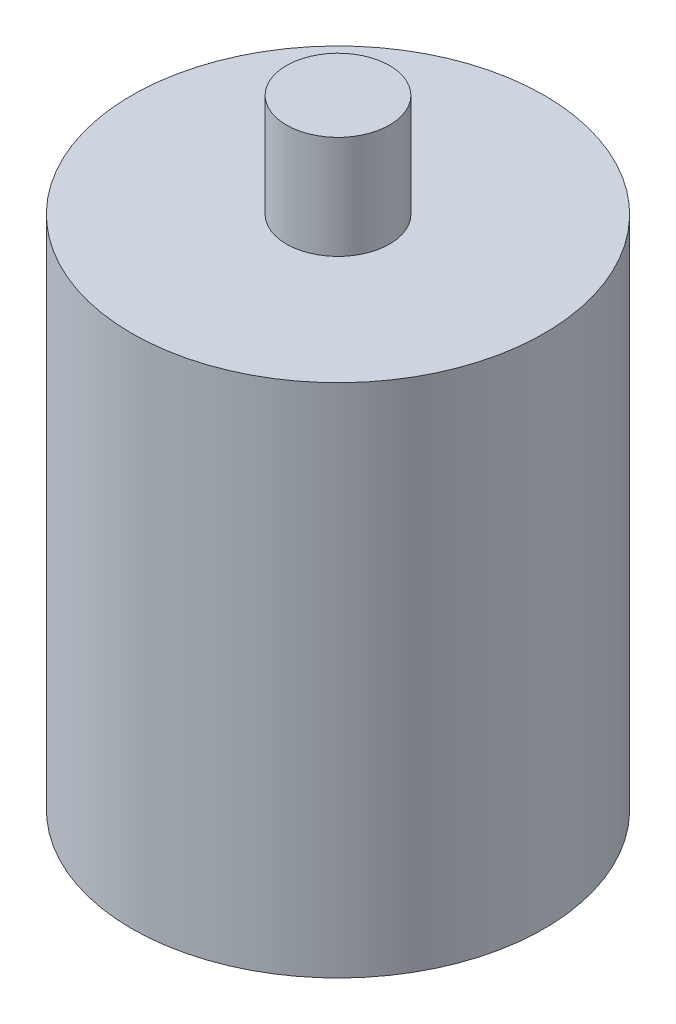
ISO-10303-21;
HEADER;
FILE_DESCRIPTION(('STEP AP214'),'2;1');
FILE_NAME('part.step','',(''),(''),'','','');
FILE_SCHEMA(('AUTOMOTIVE_DESIGN { 1 0 10303 214 1 1 1 1 }'));
ENDSEC;
DATA;
#1=APPLICATION_CONTEXT('core data for automotive mechanical design processes');
#2=APPLICATION_PROTOCOL_DEFINITION('international standard','automotive_design',2000,#1);
#3=PRODUCT_CONTEXT('',#1,'mechanical');
#4=PRODUCT('Part','Part','',(#3));
#5=PRODUCT_RELATED_PRODUCT_CATEGORY('part','',(#4));
#6=PRODUCT_DEFINITION_FORMATION('','',#4);
#7=PRODUCT_DEFINITION_CONTEXT('part definition',#1,'design');
#8=PRODUCT_DEFINITION('design','',#6,#7);
#9=PRODUCT_DEFINITION_SHAPE('','',#8);
#10=(LENGTH_UNIT() NAMED_UNIT(*) SI_UNIT(.MILLI.,.METRE.));
#11=(NAMED_UNIT(*) PLANE_ANGLE_UNIT() SI_UNIT($,.RADIAN.));
#12=(NAMED_UNIT(*) SI_UNIT($,.STERADIAN.) SOLID_ANGLE_UNIT());
#13=UNCERTAINTY_MEASURE_WITH_UNIT(LENGTH_MEASURE(1.E-05),#10,'distance_accuracy_value','');
#14=(GEOMETRIC_REPRESENTATION_CONTEXT(3) GLOBAL_UNCERTAINTY_ASSIGNED_CONTEXT((#13)) GLOBAL_UNIT_ASSIGNED_CONTEXT((#10,
#11,#12)) REPRESENTATION_CONTEXT('',''));
#15=CARTESIAN_POINT('',(0.,0.,0.));
#16=DIRECTION('',(0.,0.,1.));
#17=DIRECTION('',(1.,0.,0.));
#18=AXIS2_PLACEMENT_3D('',#15,#16,#17);
#19=CARTESIAN_POINT('',(0.,50.,0.));
#20=DIRECTION('',(0.,-1.,0.));
#21=DIRECTION('',(0.,0.,-1.));
#22=AXIS2_PLACEMENT_3D('',#19,#20,#21);
#23=CYLINDRICAL_SURFACE('',#22,20.);
#24=CARTESIAN_POINT('',(0.,50.,0.));
#25=DIRECTION('',(0.,1.,0.));
#26=DIRECTION('',(0.,0.,1.));
#27=AXIS2_PLACEMENT_3D('',#24,#25,#26);
#28=CIRCLE('',#27,20.);
#29=CARTESIAN_POINT('',(0.,50.,20.));
#30=VERTEX_POINT('',#29);
#31=EDGE_CURVE('E50',#30,#30,#28,.T.);
#32=ORIENTED_EDGE('',*,*,#31,.F.);
#33=EDGE_LOOP('',(#32));
#34=FACE_BOUND('',#33,.T.);
#35=CARTESIAN_POINT('',(0.,0.,0.));
#36=DIRECTION('',(0.,1.,0.));
#37=DIRECTION('',(0.,0.,1.));
#38=AXIS2_PLACEMENT_3D('',#35,#36,#37);
#39=CIRCLE('',#38,20.);
#40=CARTESIAN_POINT('',(0.,0.,20.));
#41=VERTEX_POINT('',#40);
#42=EDGE_CURVE('E56',#41,#41,#39,.T.);
#43=ORIENTED_EDGE('',*,*,#42,.T.);
#44=EDGE_LOOP('',(#43));
#45=FACE_BOUND('',#44,.T.);
#46=ADVANCED_FACE('F37',(#34,#45),#23,.T.);
#47=CARTESIAN_POINT('',(0.,50.,0.));
#48=DIRECTION('',(0.,1.,0.));
#49=DIRECTION('',(0.,0.,1.));
#50=AXIS2_PLACEMENT_3D('',#47,#48,#49);
#51=PLANE('',#50);
#52=CARTESIAN_POINT('',(0.,50.,0.));
#53=DIRECTION('',(0.,1.,0.));
#54=DIRECTION('',(0.,0.,1.));
#55=AXIS2_PLACEMENT_3D('',#52,#53,#54);
#56=CIRCLE('',#55,5.);
#57=CARTESIAN_POINT('',(0.,50.,5.));
#58=VERTEX_POINT('',#57);
#59=EDGE_CURVE('E10',#58,#58,#56,.T.);
#60=ORIENTED_EDGE('',*,*,#59,.F.);
#61=EDGE_LOOP('',(#60));
#62=FACE_BOUND('',#61,.T.);
#63=ORIENTED_EDGE('',*,*,#31,.T.);
#64=EDGE_LOOP('',(#63));
#65=FACE_BOUND('',#64,.T.);
#66=ADVANCED_FACE('F89',(#62,#65),#51,.T.);
#67=CARTESIAN_POINT('',(0.,0.,0.));
#68=DIRECTION('',(0.,1.,0.));
#69=DIRECTION('',(0.,0.,1.));
#70=AXIS2_PLACEMENT_3D('',#67,#68,#69);
#71=PLANE('',#70);
#72=ORIENTED_EDGE('',*,*,#42,.F.);
#73=EDGE_LOOP('',(#72));
#74=FACE_BOUND('',#73,.T.);
#75=ADVANCED_FACE('F94',(#74),#71,.F.);
#76=CARTESIAN_POINT('',(0.,60.,0.));
#77=DIRECTION('',(0.,-1.,0.));
#78=DIRECTION('',(0.,0.,-1.));
#79=AXIS2_PLACEMENT_3D('',#76,#77,#78);
#80=CYLINDRICAL_SURFACE('',#79,5.);
#81=CARTESIAN_POINT('',(0.,57.3364901443991,-5.));
#82=CARTESIAN_POINT('',(-0.0822886127533002,57.3364891469142,-4.9999992925055));
#83=CARTESIAN_POINT('',(-0.16458731835153,57.3296962807751,-4.99794915693954));
#84=CARTESIAN_POINT('',(-0.326788125304881,57.302768790177,-4.98997105593691));
#85=CARTESIAN_POINT('',(-0.40668950441142,57.2826301863757,-4.98404193389692));
#86=CARTESIAN_POINT('',(-0.561732707754528,57.2297441274888,-4.96895552501836));
#87=CARTESIAN_POINT('',(-0.636881364395375,57.1970152747801,-4.95980300250425));
#88=CARTESIAN_POINT('',(-0.780624181053133,57.1199540513432,-4.93922109237645));
#89=CARTESIAN_POINT('',(-0.84921746746967,57.0756201370037,-4.92779140192067));
#90=CARTESIAN_POINT('',(-0.979871797183745,56.9752661369264,-4.90350737192774));
#91=CARTESIAN_POINT('',(-1.04171807124434,56.9189735185132,-4.89062383657036));
#92=CARTESIAN_POINT('',(-1.15524920923324,56.7968809144889,-4.86505834210442));
#93=CARTESIAN_POINT('',(-1.20693236327441,56.7310793322741,-4.85237641724501));
#94=CARTESIAN_POINT('',(-1.29980037723708,56.5900193913615,-4.82834113993772));
#95=CARTESIAN_POINT('',(-1.34072309022214,56.5145816834083,-4.81702406663875));
#96=CARTESIAN_POINT('',(-1.4092139477476,56.3575008901688,-4.79743620394031));
#97=CARTESIAN_POINT('',(-1.43678529919973,56.2758593004711,-4.78916468313311));
#98=CARTESIAN_POINT('',(-1.47701633682652,56.1110998782686,-4.77690870838434));
#99=CARTESIAN_POINT('',(-1.49007196234677,56.0280874005351,-4.77281069324533));
#100=CARTESIAN_POINT('',(-1.50213730614672,55.8609569881823,-4.76902789749767));
#101=CARTESIAN_POINT('',(-1.50115042761078,55.77683932634,-4.76934204760571));
#102=CARTESIAN_POINT('',(-1.48546977199812,55.6131062357906,-4.77424744067778));
#103=CARTESIAN_POINT('',(-1.47127205262685,55.5334378940368,-4.7786838859914));
#104=CARTESIAN_POINT('',(-1.43037420427056,55.3776703581256,-4.79108356228624));
#105=CARTESIAN_POINT('',(-1.40367284141641,55.3015715170247,-4.79904714132351));
#106=CARTESIAN_POINT('',(-1.33816026653681,55.1538897947383,-4.81772733074973));
#107=CARTESIAN_POINT('',(-1.29918816934642,55.0823830604438,-4.82848016115952));
#108=CARTESIAN_POINT('',(-1.21035222588683,54.9467581223889,-4.85150987000065));
#109=CARTESIAN_POINT('',(-1.16048574002588,54.8826417149853,-4.86378711746991));
#110=CARTESIAN_POINT('',(-1.04881290765546,54.760803953637,-4.88911011297937));
#111=CARTESIAN_POINT('',(-0.986594907466972,54.7034614803694,-4.90216654310498));
#112=CARTESIAN_POINT('',(-0.853263259313966,54.5999361603348,-4.92712244063259));
#113=CARTESIAN_POINT('',(-0.782149051860887,54.5537540159846,-4.9390218351841));
#114=CARTESIAN_POINT('',(-0.632355038342803,54.4736302219343,-4.9604316006947));
#115=CARTESIAN_POINT('',(-0.55362774974795,54.4397726281492,-4.96992543668314));
#116=CARTESIAN_POINT('',(-0.391245415603519,54.3858905542994,-4.98533521832222));
#117=CARTESIAN_POINT('',(-0.307591751589581,54.3658622158666,-4.99125216186999));
#118=CARTESIAN_POINT('',(-0.140952242668331,54.3408379664997,-4.99868364643538));
#119=CARTESIAN_POINT('',(-0.0580500976011858,54.3353285585975,-5.0003485041779));
#120=CARTESIAN_POINT('',(0.107499605823385,54.3380593001111,-4.9995292324176));
#121=CARTESIAN_POINT('',(0.190147196690783,54.3462976140505,-4.99704565677756));
#122=CARTESIAN_POINT('',(0.350903605309699,54.3758747555106,-4.98830696987163));
#123=CARTESIAN_POINT('',(0.42907277261417,54.3969135319799,-4.98213829799417));
#124=CARTESIAN_POINT('',(0.580754638954522,54.4511333771773,-4.96674347841533));
#125=CARTESIAN_POINT('',(0.654266777025585,54.4843159054369,-4.95751696321085));
#126=CARTESIAN_POINT('',(0.796437189461054,54.5627433098802,-4.93669654351325));
#127=CARTESIAN_POINT('',(0.864943826199671,54.608249485347,-4.92505280829675));
#128=CARTESIAN_POINT('',(0.993523307980149,54.7097148984519,-4.90073468764317));
#129=CARTESIAN_POINT('',(1.05359403235594,54.7656767562867,-4.8880600443108));
#130=CARTESIAN_POINT('',(1.16585744551027,54.8888774527684,-4.86253171869138));
#131=CARTESIAN_POINT('',(1.21768481231504,54.9564520201708,-4.84968825033268));
#132=CARTESIAN_POINT('',(1.30928995072154,55.0996180834126,-4.82576515238463));
#133=CARTESIAN_POINT('',(1.34906803829472,55.1752093689573,-4.81468547654651));
#134=CARTESIAN_POINT('',(1.41517347127168,55.3320226356538,-4.79567189615055));
#135=CARTESIAN_POINT('',(1.4415634693705,55.4132163309357,-4.78772337843827));
#136=CARTESIAN_POINT('',(1.48021730815114,55.5791781133305,-4.77591594362794));
#137=CARTESIAN_POINT('',(1.49248598978779,55.6639449651867,-4.772055625083));
#138=CARTESIAN_POINT('',(1.50221984485059,55.8308516627753,-4.76899972496087));
#139=CARTESIAN_POINT('',(1.5002805530849,55.9129537954166,-4.76961647442754));
#140=CARTESIAN_POINT('',(1.48307505444813,56.0756042477719,-4.77499401288294));
#141=CARTESIAN_POINT('',(1.46780938124716,56.1561526295754,-4.77975463592551));
#142=CARTESIAN_POINT('',(1.42476888804136,56.3124355435419,-4.79275763670385));
#143=CARTESIAN_POINT('',(1.39715175507069,56.3882174317608,-4.80095604545965));
#144=CARTESIAN_POINT('',(1.33031507121129,56.5341325832168,-4.81990278909136));
#145=CARTESIAN_POINT('',(1.29109329962876,56.6042647620398,-4.83065161194312));
#146=CARTESIAN_POINT('',(1.20048763805072,56.7396532609262,-4.85397676425833));
#147=CARTESIAN_POINT('',(1.14871276092994,56.8046389056595,-4.86660540163798));
#148=CARTESIAN_POINT('',(1.03517434629782,56.9251926427069,-4.89201320450026));
#149=CARTESIAN_POINT('',(0.973408217134497,56.9807582838668,-4.90479240823905));
#150=CARTESIAN_POINT('',(0.839465762183243,57.0825135566941,-4.92950936570649));
#151=CARTESIAN_POINT('',(0.767037885790604,57.1283815912546,-4.94141159765674));
#152=CARTESIAN_POINT('',(0.615141373983529,57.2072253143031,-4.96260680455813));
#153=CARTESIAN_POINT('',(0.535676052998955,57.2402070326736,-4.97190099931067));
#154=CARTESIAN_POINT('',(0.380757712655282,57.2893854200518,-4.98602174969301));
#155=CARTESIAN_POINT('',(0.305786961954235,57.3070018172823,-4.99122027381068));
#156=CARTESIAN_POINT('',(0.15388019523078,57.3305536696407,-4.99820944494492));
#157=CARTESIAN_POINT('',(0.0769445098581397,57.3364910771039,-5.0000006615474));
#158=CARTESIAN_POINT('',(0.,57.3364901443991,-5.));
#159=B_SPLINE_CURVE_WITH_KNOTS('',3,(#81,#82,#83,#84,#85,#86,#87,#88,#89,#90,#91,#92,#93,#94,
#95,#96,#97,#98,#99,#100,#101,#102,#103,#104,#105,#106,#107,#108,#109,#110,#111,#112,#113,#114,
#115,#116,#117,#118,#119,#120,#121,#122,#123,#124,#125,#126,#127,#128,#129,#130,#131,#132,#133,
#134,#135,#136,#137,#138,#139,#140,#141,#142,#143,#144,#145,#146,#147,#148,#149,#150,#151,#152,
#153,#154,#155,#156,#157,#158),.UNSPECIFIED.,.T.,.F.,(4,2,2,2,2,2,2,2,2,2,2,2,2,2,2,2,2,2,2,2,2,
2,2,2,2,2,2,2,2,2,2,2,2,2,2,2,2,2,4),(0.,0.246583203612611,0.493239964846,0.739533676300876,
0.985860164412702,1.23855602948191,1.49129437288633,1.7497148100411,2.00807314543224,
2.25919689356599,2.51025978319089,2.75226016697676,2.99428443658002,3.2396242644712,
3.48502360158556,3.74067104048167,3.99633456531072,4.25371046881689,4.51101453528808,
4.75908809438545,5.00712853550327,5.24956746682327,5.49203554593729,5.74011305702909,
5.98825282000191,6.24540400322819,6.50254844252681,6.75847814951252,7.01432009460283,
7.25950155466943,7.504673196616,7.74680040402721,7.98897397553107,8.23996925679931,
8.49102974897503,8.74942996156671,9.00770911595235,9.2383169193046,9.46888616948875),.UNSPECIFIED.);
#160=CARTESIAN_POINT('',(0.,57.3364901443991,-5.));
#161=VERTEX_POINT('',#160);
#162=EDGE_CURVE('E40',#161,#161,#159,.T.);
#163=ORIENTED_EDGE('',*,*,#162,.T.);
#164=EDGE_LOOP('',(#163));
#165=FACE_BOUND('',#164,.T.);
#166=CARTESIAN_POINT('',(0.,60.,0.));
#167=DIRECTION('',(0.,1.,0.));
#168=DIRECTION('',(0.,0.,1.));
#169=AXIS2_PLACEMENT_3D('',#166,#167,#168);
#170=CIRCLE('',#169,5.);
#171=CARTESIAN_POINT('',(0.,60.,5.));
#172=VERTEX_POINT('',#171);
#173=EDGE_CURVE('E59',#172,#172,#170,.T.);
#174=ORIENTED_EDGE('',*,*,#173,.F.);
#175=EDGE_LOOP('',(#174));
#176=FACE_BOUND('',#175,.T.);
#177=ORIENTED_EDGE('',*,*,#59,.T.);
#178=EDGE_LOOP('',(#177));
#179=FACE_BOUND('',#178,.T.);
#180=ADVANCED_FACE('F102',(#165,#176,#179),#80,.T.);
#181=CARTESIAN_POINT('',(0.,60.,0.));
#182=DIRECTION('',(0.,1.,0.));
#183=DIRECTION('',(0.,0.,1.));
#184=AXIS2_PLACEMENT_3D('',#181,#182,#183);
#185=PLANE('',#184);
#186=ORIENTED_EDGE('',*,*,#173,.T.);
#187=EDGE_LOOP('',(#186));
#188=FACE_BOUND('',#187,.T.);
#189=ADVANCED_FACE('F87',(#188),#185,.T.);
#190=CARTESIAN_POINT('',(0.,55.8364901443991,-16.));
#191=DIRECTION('',(0.,0.,1.));
#192=DIRECTION('',(1.,0.,0.));
#193=AXIS2_PLACEMENT_3D('',#190,#191,#192);
#194=CYLINDRICAL_SURFACE('',#193,1.5);
#195=CARTESIAN_POINT('',(0.,55.8364901443991,0.));
#196=DIRECTION('',(0.,0.,1.));
#197=DIRECTION('',(1.,0.,0.));
#198=AXIS2_PLACEMENT_3D('',#195,#196,#197);
#199=CIRCLE('',#198,1.5);
#200=CARTESIAN_POINT('',(1.5,55.8364901443991,0.));
#201=VERTEX_POINT('',#200);
#202=EDGE_CURVE('E71',#201,#201,#199,.T.);
#203=ORIENTED_EDGE('',*,*,#202,.T.);
#204=EDGE_LOOP('',(#203));
#205=FACE_BOUND('',#204,.T.);
#206=ORIENTED_EDGE('',*,*,#162,.F.);
#207=EDGE_LOOP('',(#206));
#208=FACE_BOUND('',#207,.T.);
#209=ADVANCED_FACE('F78',(#205,#208),#194,.F.);
#210=CARTESIAN_POINT('',(0.,55.8364901443991,0.));
#211=DIRECTION('',(0.,0.,1.));
#212=DIRECTION('',(1.,0.,0.));
#213=AXIS2_PLACEMENT_3D('',#210,#211,#212);
#214=PLANE('',#213);
#215=ORIENTED_EDGE('',*,*,#202,.F.);
#216=EDGE_LOOP('',(#215));
#217=FACE_BOUND('',#216,.T.);
#218=ADVANCED_FACE('F81',(#217),#214,.F.);
#219=CLOSED_SHELL('',(#46,#66,#75,#180,#189,#209,#218));
#220=MANIFOLD_SOLID_BREP('B2',#219);
#221=ADVANCED_BREP_SHAPE_REPRESENTATION('',(#18,#220),#14);
#222=SHAPE_DEFINITION_REPRESENTATION(#9,#221);
ENDSEC;
END-ISO-10303-21;
